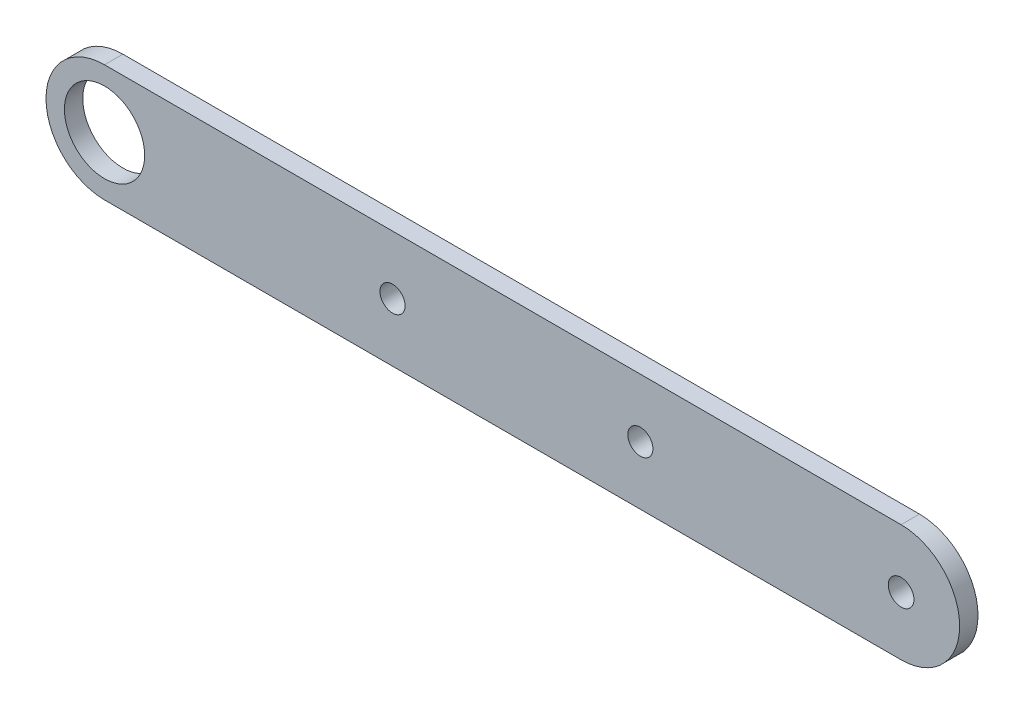
ISO-10303-21;
HEADER;
FILE_DESCRIPTION(('STEP AP214'),'2;1');
FILE_NAME('part.step','',(''),(''),'','','');
FILE_SCHEMA(('AUTOMOTIVE_DESIGN { 1 0 10303 214 1 1 1 1 }'));
ENDSEC;
DATA;
#1=APPLICATION_CONTEXT('core data for automotive mechanical design processes');
#2=APPLICATION_PROTOCOL_DEFINITION('international standard','automotive_design',2000,#1);
#3=PRODUCT_CONTEXT('',#1,'mechanical');
#4=PRODUCT('Part','Part','',(#3));
#5=PRODUCT_RELATED_PRODUCT_CATEGORY('part','',(#4));
#6=PRODUCT_DEFINITION_FORMATION('','',#4);
#7=PRODUCT_DEFINITION_CONTEXT('part definition',#1,'design');
#8=PRODUCT_DEFINITION('design','',#6,#7);
#9=PRODUCT_DEFINITION_SHAPE('','',#8);
#10=(LENGTH_UNIT() NAMED_UNIT(*) SI_UNIT(.MILLI.,.METRE.));
#11=(NAMED_UNIT(*) PLANE_ANGLE_UNIT() SI_UNIT($,.RADIAN.));
#12=(NAMED_UNIT(*) SI_UNIT($,.STERADIAN.) SOLID_ANGLE_UNIT());
#13=UNCERTAINTY_MEASURE_WITH_UNIT(LENGTH_MEASURE(1.E-05),#10,'distance_accuracy_value','');
#14=(GEOMETRIC_REPRESENTATION_CONTEXT(3) GLOBAL_UNCERTAINTY_ASSIGNED_CONTEXT((#13)) GLOBAL_UNIT_ASSIGNED_CONTEXT((#10,
#11,#12)) REPRESENTATION_CONTEXT('',''));
#15=CARTESIAN_POINT('',(0.,0.,0.));
#16=DIRECTION('',(0.,0.,1.));
#17=DIRECTION('',(1.,0.,0.));
#18=AXIS2_PLACEMENT_3D('',#15,#16,#17);
#19=CARTESIAN_POINT('',(-130.,0.,3.));
#20=DIRECTION('',(0.,0.,1.));
#21=DIRECTION('',(1.,0.,0.));
#22=AXIS2_PLACEMENT_3D('',#19,#20,#21);
#23=PLANE('',#22);
#24=CARTESIAN_POINT('',(-83.,0.,3.));
#25=DIRECTION('',(0.,0.,1.));
#26=DIRECTION('',(1.,0.,0.));
#27=AXIS2_PLACEMENT_3D('',#24,#25,#26);
#28=CIRCLE('',#27,2.04999999999999);
#29=CARTESIAN_POINT('',(-80.95,0.,3.));
#30=VERTEX_POINT('',#29);
#31=EDGE_CURVE('E122',#30,#30,#28,.T.);
#32=ORIENTED_EDGE('',*,*,#31,.F.);
#33=EDGE_LOOP('',(#32));
#34=FACE_BOUND('',#33,.T.);
#35=CARTESIAN_POINT('',(0.,0.,3.));
#36=DIRECTION('',(0.,0.,1.));
#37=DIRECTION('',(1.,0.,0.));
#38=AXIS2_PLACEMENT_3D('',#35,#36,#37);
#39=CIRCLE('',#38,2.1);
#40=CARTESIAN_POINT('',(2.1,0.,3.));
#41=VERTEX_POINT('',#40);
#42=EDGE_CURVE('E101',#41,#41,#39,.T.);
#43=ORIENTED_EDGE('',*,*,#42,.F.);
#44=EDGE_LOOP('',(#43));
#45=FACE_BOUND('',#44,.T.);
#46=CARTESIAN_POINT('',(-130.,0.,3.));
#47=DIRECTION('',(0.,0.,1.));
#48=DIRECTION('',(1.,0.,0.));
#49=AXIS2_PLACEMENT_3D('',#46,#47,#48);
#50=CIRCLE('',#49,9.55);
#51=CARTESIAN_POINT('',(-130.,9.55,3.));
#52=VERTEX_POINT('',#51);
#53=CARTESIAN_POINT('',(-130.,-9.55,3.));
#54=VERTEX_POINT('',#53);
#55=EDGE_CURVE('E86',#52,#54,#50,.T.);
#56=ORIENTED_EDGE('',*,*,#55,.T.);
#57=DIRECTION('',(1.,0.,0.));
#58=VECTOR('',#57,1.);
#59=CARTESIAN_POINT('',(-130.,-9.55,3.));
#60=LINE('',#59,#58);
#61=CARTESIAN_POINT('',(0.,-9.55,3.));
#62=VERTEX_POINT('',#61);
#63=EDGE_CURVE('E81',#54,#62,#60,.T.);
#64=ORIENTED_EDGE('',*,*,#63,.T.);
#65=CARTESIAN_POINT('',(0.,0.,3.));
#66=DIRECTION('',(0.,0.,1.));
#67=DIRECTION('',(1.,0.,0.));
#68=AXIS2_PLACEMENT_3D('',#65,#66,#67);
#69=CIRCLE('',#68,9.55);
#70=CARTESIAN_POINT('',(0.,9.55,3.));
#71=VERTEX_POINT('',#70);
#72=EDGE_CURVE('E84',#62,#71,#69,.T.);
#73=ORIENTED_EDGE('',*,*,#72,.T.);
#74=DIRECTION('',(-1.,0.,0.));
#75=VECTOR('',#74,1.);
#76=CARTESIAN_POINT('',(-130.,9.55,3.));
#77=LINE('',#76,#75);
#78=EDGE_CURVE('E51',#71,#52,#77,.T.);
#79=ORIENTED_EDGE('',*,*,#78,.T.);
#80=EDGE_LOOP('',(#56,#64,#73,#79));
#81=FACE_BOUND('',#80,.T.);
#82=CARTESIAN_POINT('',(-130.,0.,3.));
#83=DIRECTION('',(0.,0.,1.));
#84=DIRECTION('',(1.,0.,0.));
#85=AXIS2_PLACEMENT_3D('',#82,#83,#84);
#86=CIRCLE('',#85,6.55);
#87=CARTESIAN_POINT('',(-123.45,0.,3.));
#88=VERTEX_POINT('',#87);
#89=EDGE_CURVE('E116',#88,#88,#86,.T.);
#90=ORIENTED_EDGE('',*,*,#89,.F.);
#91=EDGE_LOOP('',(#90));
#92=FACE_BOUND('',#91,.T.);
#93=CARTESIAN_POINT('',(-42.55,0.,3.));
#94=DIRECTION('',(0.,0.,1.));
#95=DIRECTION('',(1.,0.,0.));
#96=AXIS2_PLACEMENT_3D('',#93,#94,#95);
#97=CIRCLE('',#96,2.04999999999999);
#98=CARTESIAN_POINT('',(-40.5,0.,3.));
#99=VERTEX_POINT('',#98);
#100=EDGE_CURVE('E128',#99,#99,#97,.T.);
#101=ORIENTED_EDGE('',*,*,#100,.F.);
#102=EDGE_LOOP('',(#101));
#103=FACE_BOUND('',#102,.T.);
#104=ADVANCED_FACE('F34',(#34,#45,#81,#92,#103),#23,.T.);
#105=CARTESIAN_POINT('',(-130.,0.,0.));
#106=DIRECTION('',(0.,0.,1.));
#107=DIRECTION('',(1.,0.,0.));
#108=AXIS2_PLACEMENT_3D('',#105,#106,#107);
#109=PLANE('',#108);
#110=CARTESIAN_POINT('',(-130.,0.,0.));
#111=DIRECTION('',(0.,0.,1.));
#112=DIRECTION('',(1.,0.,0.));
#113=AXIS2_PLACEMENT_3D('',#110,#111,#112);
#114=CIRCLE('',#113,9.55);
#115=CARTESIAN_POINT('',(-130.,9.55,0.));
#116=VERTEX_POINT('',#115);
#117=CARTESIAN_POINT('',(-130.,-9.55,0.));
#118=VERTEX_POINT('',#117);
#119=EDGE_CURVE('E98',#116,#118,#114,.T.);
#120=ORIENTED_EDGE('',*,*,#119,.F.);
#121=DIRECTION('',(-1.,0.,0.));
#122=VECTOR('',#121,1.);
#123=CARTESIAN_POINT('',(-130.,9.55,0.));
#124=LINE('',#123,#122);
#125=CARTESIAN_POINT('',(0.,9.55,0.));
#126=VERTEX_POINT('',#125);
#127=EDGE_CURVE('E74',#126,#116,#124,.T.);
#128=ORIENTED_EDGE('',*,*,#127,.F.);
#129=CARTESIAN_POINT('',(0.,0.,0.));
#130=DIRECTION('',(0.,0.,1.));
#131=DIRECTION('',(1.,0.,0.));
#132=AXIS2_PLACEMENT_3D('',#129,#130,#131);
#133=CIRCLE('',#132,9.55);
#134=CARTESIAN_POINT('',(0.,-9.55,0.));
#135=VERTEX_POINT('',#134);
#136=EDGE_CURVE('E68',#135,#126,#133,.T.);
#137=ORIENTED_EDGE('',*,*,#136,.F.);
#138=DIRECTION('',(1.,0.,0.));
#139=VECTOR('',#138,1.);
#140=CARTESIAN_POINT('',(-130.,-9.55,0.));
#141=LINE('',#140,#139);
#142=EDGE_CURVE('E90',#118,#135,#141,.T.);
#143=ORIENTED_EDGE('',*,*,#142,.F.);
#144=EDGE_LOOP('',(#120,#128,#137,#143));
#145=FACE_BOUND('',#144,.T.);
#146=CARTESIAN_POINT('',(0.,0.,0.));
#147=DIRECTION('',(0.,0.,1.));
#148=DIRECTION('',(1.,0.,0.));
#149=AXIS2_PLACEMENT_3D('',#146,#147,#148);
#150=CIRCLE('',#149,2.1);
#151=CARTESIAN_POINT('',(2.1,0.,0.));
#152=VERTEX_POINT('',#151);
#153=EDGE_CURVE('E113',#152,#152,#150,.T.);
#154=ORIENTED_EDGE('',*,*,#153,.T.);
#155=EDGE_LOOP('',(#154));
#156=FACE_BOUND('',#155,.T.);
#157=CARTESIAN_POINT('',(-130.,0.,0.));
#158=DIRECTION('',(0.,0.,1.));
#159=DIRECTION('',(1.,0.,0.));
#160=AXIS2_PLACEMENT_3D('',#157,#158,#159);
#161=CIRCLE('',#160,6.55);
#162=CARTESIAN_POINT('',(-123.45,0.,0.));
#163=VERTEX_POINT('',#162);
#164=EDGE_CURVE('E119',#163,#163,#161,.T.);
#165=ORIENTED_EDGE('',*,*,#164,.T.);
#166=EDGE_LOOP('',(#165));
#167=FACE_BOUND('',#166,.T.);
#168=CARTESIAN_POINT('',(-83.,0.,0.));
#169=DIRECTION('',(0.,0.,1.));
#170=DIRECTION('',(1.,0.,0.));
#171=AXIS2_PLACEMENT_3D('',#168,#169,#170);
#172=CIRCLE('',#171,2.04999999999999);
#173=CARTESIAN_POINT('',(-80.95,0.,0.));
#174=VERTEX_POINT('',#173);
#175=EDGE_CURVE('E125',#174,#174,#172,.T.);
#176=ORIENTED_EDGE('',*,*,#175,.T.);
#177=EDGE_LOOP('',(#176));
#178=FACE_BOUND('',#177,.T.);
#179=CARTESIAN_POINT('',(-42.55,0.,0.));
#180=DIRECTION('',(0.,0.,1.));
#181=DIRECTION('',(1.,0.,0.));
#182=AXIS2_PLACEMENT_3D('',#179,#180,#181);
#183=CIRCLE('',#182,2.04999999999999);
#184=CARTESIAN_POINT('',(-40.5,0.,0.));
#185=VERTEX_POINT('',#184);
#186=EDGE_CURVE('E131',#185,#185,#183,.T.);
#187=ORIENTED_EDGE('',*,*,#186,.T.);
#188=EDGE_LOOP('',(#187));
#189=FACE_BOUND('',#188,.T.);
#190=ADVANCED_FACE('F109',(#145,#156,#167,#178,#189),#109,.F.);
#191=CARTESIAN_POINT('',(-130.,0.,3.));
#192=DIRECTION('',(0.,0.,-1.));
#193=DIRECTION('',(-1.,0.,0.));
#194=AXIS2_PLACEMENT_3D('',#191,#192,#193);
#195=CYLINDRICAL_SURFACE('',#194,9.55);
#196=ORIENTED_EDGE('',*,*,#119,.T.);
#197=DIRECTION('',(0.,0.,-1.));
#198=VECTOR('',#197,1.);
#199=CARTESIAN_POINT('',(-130.,-9.55,3.));
#200=LINE('',#199,#198);
#201=EDGE_CURVE('E11',#54,#118,#200,.T.);
#202=ORIENTED_EDGE('',*,*,#201,.F.);
#203=ORIENTED_EDGE('',*,*,#55,.F.);
#204=DIRECTION('',(0.,0.,-1.));
#205=VECTOR('',#204,1.);
#206=CARTESIAN_POINT('',(-130.,9.55,3.));
#207=LINE('',#206,#205);
#208=EDGE_CURVE('E94',#52,#116,#207,.T.);
#209=ORIENTED_EDGE('',*,*,#208,.T.);
#210=EDGE_LOOP('',(#196,#202,#203,#209));
#211=FACE_BOUND('',#210,.T.);
#212=ADVANCED_FACE('F36',(#211),#195,.T.);
#213=CARTESIAN_POINT('',(-130.,-9.55,3.));
#214=DIRECTION('',(0.,1.,0.));
#215=DIRECTION('',(0.,0.,1.));
#216=AXIS2_PLACEMENT_3D('',#213,#214,#215);
#217=PLANE('',#216);
#218=ORIENTED_EDGE('',*,*,#142,.T.);
#219=DIRECTION('',(0.,0.,-1.));
#220=VECTOR('',#219,1.);
#221=CARTESIAN_POINT('',(0.,-9.55,3.));
#222=LINE('',#221,#220);
#223=EDGE_CURVE('E43',#62,#135,#222,.T.);
#224=ORIENTED_EDGE('',*,*,#223,.F.);
#225=ORIENTED_EDGE('',*,*,#63,.F.);
#226=ORIENTED_EDGE('',*,*,#201,.T.);
#227=EDGE_LOOP('',(#218,#224,#225,#226));
#228=FACE_BOUND('',#227,.T.);
#229=ADVANCED_FACE('F89',(#228),#217,.F.);
#230=CARTESIAN_POINT('',(0.,0.,3.));
#231=DIRECTION('',(0.,0.,-1.));
#232=DIRECTION('',(-1.,0.,0.));
#233=AXIS2_PLACEMENT_3D('',#230,#231,#232);
#234=CYLINDRICAL_SURFACE('',#233,9.55);
#235=ORIENTED_EDGE('',*,*,#136,.T.);
#236=DIRECTION('',(0.,0.,-1.));
#237=VECTOR('',#236,1.);
#238=CARTESIAN_POINT('',(0.,9.55,3.));
#239=LINE('',#238,#237);
#240=EDGE_CURVE('E91',#71,#126,#239,.T.);
#241=ORIENTED_EDGE('',*,*,#240,.F.);
#242=ORIENTED_EDGE('',*,*,#72,.F.);
#243=ORIENTED_EDGE('',*,*,#223,.T.);
#244=EDGE_LOOP('',(#235,#241,#242,#243));
#245=FACE_BOUND('',#244,.T.);
#246=ADVANCED_FACE('F92',(#245),#234,.T.);
#247=CARTESIAN_POINT('',(-130.,9.55,3.));
#248=DIRECTION('',(0.,-1.,0.));
#249=DIRECTION('',(0.,0.,-1.));
#250=AXIS2_PLACEMENT_3D('',#247,#248,#249);
#251=PLANE('',#250);
#252=ORIENTED_EDGE('',*,*,#127,.T.);
#253=ORIENTED_EDGE('',*,*,#208,.F.);
#254=ORIENTED_EDGE('',*,*,#78,.F.);
#255=ORIENTED_EDGE('',*,*,#240,.T.);
#256=EDGE_LOOP('',(#252,#253,#254,#255));
#257=FACE_BOUND('',#256,.T.);
#258=ADVANCED_FACE('F106',(#257),#251,.F.);
#259=CARTESIAN_POINT('',(0.,0.,3.));
#260=DIRECTION('',(0.,0.,-1.));
#261=DIRECTION('',(-1.,0.,0.));
#262=AXIS2_PLACEMENT_3D('',#259,#260,#261);
#263=CYLINDRICAL_SURFACE('',#262,2.1);
#264=ORIENTED_EDGE('',*,*,#42,.T.);
#265=EDGE_LOOP('',(#264));
#266=FACE_BOUND('',#265,.T.);
#267=ORIENTED_EDGE('',*,*,#153,.F.);
#268=EDGE_LOOP('',(#267));
#269=FACE_BOUND('',#268,.T.);
#270=ADVANCED_FACE('F150',(#266,#269),#263,.F.);
#271=CARTESIAN_POINT('',(-130.,0.,3.));
#272=DIRECTION('',(0.,0.,-1.));
#273=DIRECTION('',(-1.,0.,0.));
#274=AXIS2_PLACEMENT_3D('',#271,#272,#273);
#275=CYLINDRICAL_SURFACE('',#274,6.55);
#276=ORIENTED_EDGE('',*,*,#89,.T.);
#277=EDGE_LOOP('',(#276));
#278=FACE_BOUND('',#277,.T.);
#279=ORIENTED_EDGE('',*,*,#164,.F.);
#280=EDGE_LOOP('',(#279));
#281=FACE_BOUND('',#280,.T.);
#282=ADVANCED_FACE('F196',(#278,#281),#275,.F.);
#283=CARTESIAN_POINT('',(-83.,0.,3.));
#284=DIRECTION('',(0.,0.,-1.));
#285=DIRECTION('',(-1.,0.,0.));
#286=AXIS2_PLACEMENT_3D('',#283,#284,#285);
#287=CYLINDRICAL_SURFACE('',#286,2.04999999999999);
#288=ORIENTED_EDGE('',*,*,#31,.T.);
#289=EDGE_LOOP('',(#288));
#290=FACE_BOUND('',#289,.T.);
#291=ORIENTED_EDGE('',*,*,#175,.F.);
#292=EDGE_LOOP('',(#291));
#293=FACE_BOUND('',#292,.T.);
#294=ADVANCED_FACE('F204',(#290,#293),#287,.F.);
#295=CARTESIAN_POINT('',(-42.55,0.,3.));
#296=DIRECTION('',(0.,0.,-1.));
#297=DIRECTION('',(-1.,0.,0.));
#298=AXIS2_PLACEMENT_3D('',#295,#296,#297);
#299=CYLINDRICAL_SURFACE('',#298,2.04999999999999);
#300=ORIENTED_EDGE('',*,*,#100,.T.);
#301=EDGE_LOOP('',(#300));
#302=FACE_BOUND('',#301,.T.);
#303=ORIENTED_EDGE('',*,*,#186,.F.);
#304=EDGE_LOOP('',(#303));
#305=FACE_BOUND('',#304,.T.);
#306=ADVANCED_FACE('F137',(#302,#305),#299,.F.);
#307=CLOSED_SHELL('',(#104,#190,#212,#229,#246,#258,#270,#282,#294,#306));
#308=MANIFOLD_SOLID_BREP('B2',#307);
#309=ADVANCED_BREP_SHAPE_REPRESENTATION('',(#18,#308),#14);
#310=SHAPE_DEFINITION_REPRESENTATION(#9,#309);
ENDSEC;
END-ISO-10303-21;
